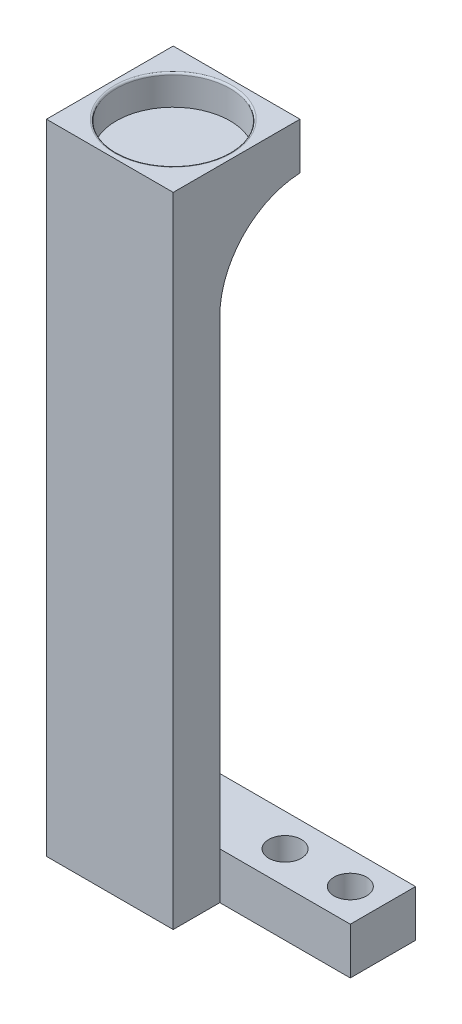
ISO-10303-21;
HEADER;
FILE_DESCRIPTION(('STEP AP214'),'2;1');
FILE_NAME('part.step','',(''),(''),'','','');
FILE_SCHEMA(('AUTOMOTIVE_DESIGN { 1 0 10303 214 1 1 1 1 }'));
ENDSEC;
DATA;
#1=APPLICATION_CONTEXT('core data for automotive mechanical design processes');
#2=APPLICATION_PROTOCOL_DEFINITION('international standard','automotive_design',2000,#1);
#3=PRODUCT_CONTEXT('',#1,'mechanical');
#4=PRODUCT('Part','Part','',(#3));
#5=PRODUCT_RELATED_PRODUCT_CATEGORY('part','',(#4));
#6=PRODUCT_DEFINITION_FORMATION('','',#4);
#7=PRODUCT_DEFINITION_CONTEXT('part definition',#1,'design');
#8=PRODUCT_DEFINITION('design','',#6,#7);
#9=PRODUCT_DEFINITION_SHAPE('','',#8);
#10=(LENGTH_UNIT() NAMED_UNIT(*) SI_UNIT(.MILLI.,.METRE.));
#11=(NAMED_UNIT(*) PLANE_ANGLE_UNIT() SI_UNIT($,.RADIAN.));
#12=(NAMED_UNIT(*) SI_UNIT($,.STERADIAN.) SOLID_ANGLE_UNIT());
#13=UNCERTAINTY_MEASURE_WITH_UNIT(LENGTH_MEASURE(1.E-05),#10,'distance_accuracy_value','');
#14=(GEOMETRIC_REPRESENTATION_CONTEXT(3) GLOBAL_UNCERTAINTY_ASSIGNED_CONTEXT((#13)) GLOBAL_UNIT_ASSIGNED_CONTEXT((#10,
#11,#12)) REPRESENTATION_CONTEXT('',''));
#15=CARTESIAN_POINT('',(0.,0.,0.));
#16=DIRECTION('',(0.,0.,1.));
#17=DIRECTION('',(1.,0.,0.));
#18=AXIS2_PLACEMENT_3D('',#15,#16,#17);
#19=CARTESIAN_POINT('',(20.4,-63.5,1.79999999999999));
#20=DIRECTION('',(0.,0.,1.));
#21=DIRECTION('',(-1.,0.,0.));
#22=AXIS2_PLACEMENT_3D('',#19,#20,#21);
#23=PLANE('',#22);
#24=DIRECTION('',(-1.,0.,0.));
#25=VECTOR('',#24,1.);
#26=CARTESIAN_POINT('',(6.8,-58.5,1.8));
#27=LINE('',#26,#25);
#28=CARTESIAN_POINT('',(20.4,-58.5,1.79999999999999));
#29=VERTEX_POINT('',#28);
#30=CARTESIAN_POINT('',(6.8,-58.5,1.8));
#31=VERTEX_POINT('',#30);
#32=EDGE_CURVE('E137',#29,#31,#27,.T.);
#33=ORIENTED_EDGE('',*,*,#32,.T.);
#34=DIRECTION('',(0.,1.,0.));
#35=VECTOR('',#34,1.);
#36=CARTESIAN_POINT('',(6.8,-63.5,1.8));
#37=LINE('',#36,#35);
#38=CARTESIAN_POINT('',(6.8,-8.99110671719561,1.8));
#39=VERTEX_POINT('',#38);
#40=EDGE_CURVE('E161',#31,#39,#37,.T.);
#41=ORIENTED_EDGE('',*,*,#40,.T.);
#42=DIRECTION('',(-1.,0.,0.));
#43=VECTOR('',#42,1.);
#44=CARTESIAN_POINT('',(20.4,-8.99110671719561,1.79999999999999));
#45=LINE('',#44,#43);
#46=CARTESIAN_POINT('',(20.4,-8.99110671719561,1.79999999999999));
#47=VERTEX_POINT('',#46);
#48=EDGE_CURVE('E200',#47,#39,#45,.T.);
#49=ORIENTED_EDGE('',*,*,#48,.F.);
#50=DIRECTION('',(0.,1.,0.));
#51=VECTOR('',#50,1.);
#52=CARTESIAN_POINT('',(20.4,-63.5,1.79999999999999));
#53=LINE('',#52,#51);
#54=EDGE_CURVE('E164',#29,#47,#53,.T.);
#55=ORIENTED_EDGE('',*,*,#54,.F.);
#56=EDGE_LOOP('',(#33,#41,#49,#55));
#57=FACE_BOUND('',#56,.T.);
#58=ADVANCED_FACE('F39',(#57),#23,.F.);
#59=CARTESIAN_POINT('',(6.8,5.,-6.8));
#60=DIRECTION('',(1.,0.,0.));
#61=DIRECTION('',(0.,0.,1.));
#62=AXIS2_PLACEMENT_3D('',#59,#60,#61);
#63=PLANE('',#62);
#64=DIRECTION('',(0.,-1.,0.));
#65=VECTOR('',#64,1.);
#66=CARTESIAN_POINT('',(6.8,5.,6.8));
#67=LINE('',#66,#65);
#68=CARTESIAN_POINT('',(6.8,5.,6.8));
#69=VERTEX_POINT('',#68);
#70=CARTESIAN_POINT('',(6.8,-63.5,6.8));
#71=VERTEX_POINT('',#70);
#72=EDGE_CURVE('E183',#69,#71,#67,.T.);
#73=ORIENTED_EDGE('',*,*,#72,.F.);
#74=DIRECTION('',(0.,0.,-1.));
#75=VECTOR('',#74,1.);
#76=CARTESIAN_POINT('',(6.8,5.,-6.8));
#77=LINE('',#76,#75);
#78=CARTESIAN_POINT('',(6.8,5.,-6.8));
#79=VERTEX_POINT('',#78);
#80=EDGE_CURVE('E172',#69,#79,#77,.T.);
#81=ORIENTED_EDGE('',*,*,#80,.T.);
#82=DIRECTION('',(0.,-1.,0.));
#83=VECTOR('',#82,1.);
#84=CARTESIAN_POINT('',(6.8,5.,-6.8));
#85=LINE('',#84,#83);
#86=CARTESIAN_POINT('',(6.8,0.,-6.8));
#87=VERTEX_POINT('',#86);
#88=EDGE_CURVE('E192',#79,#87,#85,.T.);
#89=ORIENTED_EDGE('',*,*,#88,.T.);
#90=CARTESIAN_POINT('',(6.8,-8.99110671719561,-7.2));
#91=DIRECTION('',(-1.,0.,0.));
#92=DIRECTION('',(0.,0.,1.));
#93=AXIS2_PLACEMENT_3D('',#90,#91,#92);
#94=CIRCLE('',#93,9.);
#95=EDGE_CURVE('E47',#39,#87,#94,.T.);
#96=ORIENTED_EDGE('',*,*,#95,.F.);
#97=ORIENTED_EDGE('',*,*,#40,.F.);
#98=DIRECTION('',(0.,0.,1.));
#99=VECTOR('',#98,1.);
#100=CARTESIAN_POINT('',(6.8,-58.5,-5.2));
#101=LINE('',#100,#99);
#102=CARTESIAN_POINT('',(6.8,-58.5,-5.2));
#103=VERTEX_POINT('',#102);
#104=EDGE_CURVE('E134',#103,#31,#101,.T.);
#105=ORIENTED_EDGE('',*,*,#104,.F.);
#106=DIRECTION('',(0.,-1.,0.));
#107=VECTOR('',#106,1.);
#108=CARTESIAN_POINT('',(6.8,-63.5,-5.2));
#109=LINE('',#108,#107);
#110=CARTESIAN_POINT('',(6.8,-63.5,-5.2));
#111=VERTEX_POINT('',#110);
#112=EDGE_CURVE('E116',#103,#111,#109,.T.);
#113=ORIENTED_EDGE('',*,*,#112,.T.);
#114=DIRECTION('',(0.,0.,1.));
#115=VECTOR('',#114,1.);
#116=CARTESIAN_POINT('',(6.8,-63.5,6.8));
#117=LINE('',#116,#115);
#118=EDGE_CURVE('E125',#111,#71,#117,.T.);
#119=ORIENTED_EDGE('',*,*,#118,.T.);
#120=EDGE_LOOP('',(#73,#81,#89,#96,#97,#105,#113,#119));
#121=FACE_BOUND('',#120,.T.);
#122=ADVANCED_FACE('F133',(#121),#63,.F.);
#123=CARTESIAN_POINT('',(20.4,5.,-6.8));
#124=DIRECTION('',(0.,0.,1.));
#125=DIRECTION('',(-1.,0.,0.));
#126=AXIS2_PLACEMENT_3D('',#123,#124,#125);
#127=PLANE('',#126);
#128=DIRECTION('',(1.,0.,0.));
#129=VECTOR('',#128,1.);
#130=CARTESIAN_POINT('',(20.4,0.,-6.8));
#131=LINE('',#130,#129);
#132=CARTESIAN_POINT('',(20.4,0.,-6.8));
#133=VERTEX_POINT('',#132);
#134=EDGE_CURVE('E171',#87,#133,#131,.T.);
#135=ORIENTED_EDGE('',*,*,#134,.F.);
#136=ORIENTED_EDGE('',*,*,#88,.F.);
#137=DIRECTION('',(1.,0.,0.));
#138=VECTOR('',#137,1.);
#139=CARTESIAN_POINT('',(20.4,5.,-6.8));
#140=LINE('',#139,#138);
#141=CARTESIAN_POINT('',(20.4,5.,-6.8));
#142=VERTEX_POINT('',#141);
#143=EDGE_CURVE('E175',#79,#142,#140,.T.);
#144=ORIENTED_EDGE('',*,*,#143,.T.);
#145=DIRECTION('',(0.,-1.,0.));
#146=VECTOR('',#145,1.);
#147=CARTESIAN_POINT('',(20.4,5.,-6.8));
#148=LINE('',#147,#146);
#149=EDGE_CURVE('E189',#142,#133,#148,.T.);
#150=ORIENTED_EDGE('',*,*,#149,.T.);
#151=EDGE_LOOP('',(#135,#136,#144,#150));
#152=FACE_BOUND('',#151,.T.);
#153=ADVANCED_FACE('F205',(#152),#127,.F.);
#154=CARTESIAN_POINT('',(20.4,5.,-6.8));
#155=DIRECTION('',(-1.,0.,0.));
#156=DIRECTION('',(0.,0.,-1.));
#157=AXIS2_PLACEMENT_3D('',#154,#155,#156);
#158=PLANE('',#157);
#159=ORIENTED_EDGE('',*,*,#149,.F.);
#160=DIRECTION('',(0.,0.,1.));
#161=VECTOR('',#160,1.);
#162=CARTESIAN_POINT('',(20.4,5.,-6.8));
#163=LINE('',#162,#161);
#164=CARTESIAN_POINT('',(20.4,5.,6.79999999999999));
#165=VERTEX_POINT('',#164);
#166=EDGE_CURVE('E178',#142,#165,#163,.T.);
#167=ORIENTED_EDGE('',*,*,#166,.T.);
#168=DIRECTION('',(0.,-1.,0.));
#169=VECTOR('',#168,1.);
#170=CARTESIAN_POINT('',(20.4,5.,6.79999999999999));
#171=LINE('',#170,#169);
#172=CARTESIAN_POINT('',(20.4,-63.5,6.79999999999999));
#173=VERTEX_POINT('',#172);
#174=EDGE_CURVE('E186',#165,#173,#171,.T.);
#175=ORIENTED_EDGE('',*,*,#174,.T.);
#176=DIRECTION('',(0.,0.,-1.));
#177=VECTOR('',#176,1.);
#178=CARTESIAN_POINT('',(20.4,-63.5,6.79999999999999));
#179=LINE('',#178,#177);
#180=CARTESIAN_POINT('',(20.4,-63.5,1.79999999999999));
#181=VERTEX_POINT('',#180);
#182=EDGE_CURVE('E131',#173,#181,#179,.T.);
#183=ORIENTED_EDGE('',*,*,#182,.T.);
#184=EDGE_CURVE('E165',#181,#29,#53,.T.);
#185=ORIENTED_EDGE('',*,*,#184,.T.);
#186=ORIENTED_EDGE('',*,*,#54,.T.);
#187=CARTESIAN_POINT('',(20.4,-8.99110671719561,-7.20000000000001));
#188=DIRECTION('',(1.,0.,0.));
#189=DIRECTION('',(0.,0.,-1.));
#190=AXIS2_PLACEMENT_3D('',#187,#188,#189);
#191=CIRCLE('',#190,9.);
#192=EDGE_CURVE('E11',#133,#47,#191,.T.);
#193=ORIENTED_EDGE('',*,*,#192,.F.);
#194=EDGE_LOOP('',(#159,#167,#175,#183,#185,#186,#193));
#195=FACE_BOUND('',#194,.T.);
#196=ADVANCED_FACE('F208',(#195),#158,.F.);
#197=CARTESIAN_POINT('',(20.4,5.,6.79999999999999));
#198=DIRECTION('',(0.,0.,-1.));
#199=DIRECTION('',(1.,0.,0.));
#200=AXIS2_PLACEMENT_3D('',#197,#198,#199);
#201=PLANE('',#200);
#202=ORIENTED_EDGE('',*,*,#174,.F.);
#203=DIRECTION('',(-1.,0.,0.));
#204=VECTOR('',#203,1.);
#205=CARTESIAN_POINT('',(20.4,5.,6.79999999999999));
#206=LINE('',#205,#204);
#207=EDGE_CURVE('E181',#165,#69,#206,.T.);
#208=ORIENTED_EDGE('',*,*,#207,.T.);
#209=ORIENTED_EDGE('',*,*,#72,.T.);
#210=DIRECTION('',(1.,0.,0.));
#211=VECTOR('',#210,1.);
#212=CARTESIAN_POINT('',(20.4,-63.5,6.79999999999999));
#213=LINE('',#212,#211);
#214=EDGE_CURVE('E128',#71,#173,#213,.T.);
#215=ORIENTED_EDGE('',*,*,#214,.T.);
#216=EDGE_LOOP('',(#202,#208,#209,#215));
#217=FACE_BOUND('',#216,.T.);
#218=ADVANCED_FACE('F224',(#217),#201,.F.);
#219=CARTESIAN_POINT('',(13.6,5.,0.));
#220=DIRECTION('',(0.,1.,0.));
#221=DIRECTION('',(0.,0.,1.));
#222=AXIS2_PLACEMENT_3D('',#219,#220,#221);
#223=PLANE('',#222);
#224=CARTESIAN_POINT('',(13.6,5.,0.));
#225=DIRECTION('',(0.,-1.,0.));
#226=DIRECTION('',(0.,0.,1.));
#227=AXIS2_PLACEMENT_3D('',#224,#225,#226);
#228=CIRCLE('',#227,6.3);
#229=CARTESIAN_POINT('',(13.6,5.,6.3));
#230=VERTEX_POINT('',#229);
#231=EDGE_CURVE('E197',#230,#230,#228,.F.);
#232=ORIENTED_EDGE('',*,*,#231,.F.);
#233=EDGE_LOOP('',(#232));
#234=FACE_BOUND('',#233,.T.);
#235=ORIENTED_EDGE('',*,*,#80,.F.);
#236=ORIENTED_EDGE('',*,*,#207,.F.);
#237=ORIENTED_EDGE('',*,*,#166,.F.);
#238=ORIENTED_EDGE('',*,*,#143,.F.);
#239=EDGE_LOOP('',(#235,#236,#237,#238));
#240=FACE_BOUND('',#239,.T.);
#241=ADVANCED_FACE('F226',(#234,#240),#223,.T.);
#242=CARTESIAN_POINT('',(13.6,1.8,0.));
#243=DIRECTION('',(0.,1.,0.));
#244=DIRECTION('',(0.,0.,1.));
#245=AXIS2_PLACEMENT_3D('',#242,#243,#244);
#246=CYLINDRICAL_SURFACE('',#245,6.1);
#247=CARTESIAN_POINT('',(13.6,4.8,0.));
#248=DIRECTION('',(0.,-1.,0.));
#249=DIRECTION('',(0.,0.,1.));
#250=AXIS2_PLACEMENT_3D('',#247,#248,#249);
#251=CIRCLE('',#250,6.1);
#252=CARTESIAN_POINT('',(13.6,4.8,6.1));
#253=VERTEX_POINT('',#252);
#254=EDGE_CURVE('E194',#253,#253,#251,.T.);
#255=ORIENTED_EDGE('',*,*,#254,.F.);
#256=EDGE_LOOP('',(#255));
#257=FACE_BOUND('',#256,.T.);
#258=CARTESIAN_POINT('',(13.6,1.8,0.));
#259=DIRECTION('',(0.,-1.,0.));
#260=DIRECTION('',(0.,0.,1.));
#261=AXIS2_PLACEMENT_3D('',#258,#259,#260);
#262=CIRCLE('',#261,6.1);
#263=CARTESIAN_POINT('',(13.6,1.8,6.1));
#264=VERTEX_POINT('',#263);
#265=EDGE_CURVE('E168',#264,#264,#262,.T.);
#266=ORIENTED_EDGE('',*,*,#265,.T.);
#267=EDGE_LOOP('',(#266));
#268=FACE_BOUND('',#267,.T.);
#269=ADVANCED_FACE('F228',(#257,#268),#246,.F.);
#270=CARTESIAN_POINT('',(13.6,1.8,0.));
#271=DIRECTION('',(0.,1.,0.));
#272=DIRECTION('',(0.,0.,1.));
#273=AXIS2_PLACEMENT_3D('',#270,#271,#272);
#274=PLANE('',#273);
#275=ORIENTED_EDGE('',*,*,#265,.F.);
#276=EDGE_LOOP('',(#275));
#277=FACE_BOUND('',#276,.T.);
#278=ADVANCED_FACE('F235',(#277),#274,.T.);
#279=CARTESIAN_POINT('',(13.6,-63.5,0.));
#280=DIRECTION('',(0.,-1.,0.));
#281=DIRECTION('',(0.,0.,-1.));
#282=AXIS2_PLACEMENT_3D('',#279,#280,#281);
#283=PLANE('',#282);
#284=CARTESIAN_POINT('',(23.9,-63.5,-1.70000000000001));
#285=DIRECTION('',(0.,-1.,0.));
#286=DIRECTION('',(0.,0.,1.));
#287=AXIS2_PLACEMENT_3D('',#284,#285,#286);
#288=CIRCLE('',#287,1.75);
#289=CARTESIAN_POINT('',(23.9,-63.5,0.0499999999999912));
#290=VERTEX_POINT('',#289);
#291=EDGE_CURVE('E150',#290,#290,#288,.T.);
#292=ORIENTED_EDGE('',*,*,#291,.F.);
#293=EDGE_LOOP('',(#292));
#294=FACE_BOUND('',#293,.T.);
#295=CARTESIAN_POINT('',(30.9,-63.5,-1.70000000000001));
#296=DIRECTION('',(0.,-1.,0.));
#297=DIRECTION('',(0.,0.,1.));
#298=AXIS2_PLACEMENT_3D('',#295,#296,#297);
#299=CIRCLE('',#298,1.75);
#300=CARTESIAN_POINT('',(30.9,-63.5,0.0499999999999904));
#301=VERTEX_POINT('',#300);
#302=EDGE_CURVE('E140',#301,#301,#299,.T.);
#303=ORIENTED_EDGE('',*,*,#302,.F.);
#304=EDGE_LOOP('',(#303));
#305=FACE_BOUND('',#304,.T.);
#306=ORIENTED_EDGE('',*,*,#182,.F.);
#307=ORIENTED_EDGE('',*,*,#214,.F.);
#308=ORIENTED_EDGE('',*,*,#118,.F.);
#309=DIRECTION('',(1.,0.,0.));
#310=VECTOR('',#309,1.);
#311=CARTESIAN_POINT('',(6.8,-63.5,-5.2));
#312=LINE('',#311,#310);
#313=CARTESIAN_POINT('',(34.4,-63.5,-5.20000000000001));
#314=VERTEX_POINT('',#313);
#315=EDGE_CURVE('E112',#111,#314,#312,.T.);
#316=ORIENTED_EDGE('',*,*,#315,.T.);
#317=DIRECTION('',(0.,0.,1.));
#318=VECTOR('',#317,1.);
#319=CARTESIAN_POINT('',(34.4,-63.5,-5.20000000000001));
#320=LINE('',#319,#318);
#321=CARTESIAN_POINT('',(34.4,-63.5,1.79999999999999));
#322=VERTEX_POINT('',#321);
#323=EDGE_CURVE('E156',#314,#322,#320,.T.);
#324=ORIENTED_EDGE('',*,*,#323,.T.);
#325=DIRECTION('',(1.,0.,0.));
#326=VECTOR('',#325,1.);
#327=CARTESIAN_POINT('',(6.8,-63.5,1.8));
#328=LINE('',#327,#326);
#329=EDGE_CURVE('E146',#181,#322,#328,.T.);
#330=ORIENTED_EDGE('',*,*,#329,.F.);
#331=EDGE_LOOP('',(#306,#307,#308,#316,#324,#330));
#332=FACE_BOUND('',#331,.T.);
#333=ADVANCED_FACE('F127',(#294,#305,#332),#283,.T.);
#334=CARTESIAN_POINT('',(13.6,4.8,0.));
#335=DIRECTION('',(0.,1.,0.));
#336=DIRECTION('',(0.,0.,1.));
#337=AXIS2_PLACEMENT_3D('',#334,#335,#336);
#338=TOROIDAL_SURFACE('',#337,6.3,0.2);
#339=ORIENTED_EDGE('',*,*,#231,.T.);
#340=EDGE_LOOP('',(#339));
#341=FACE_BOUND('',#340,.T.);
#342=ORIENTED_EDGE('',*,*,#254,.T.);
#343=EDGE_LOOP('',(#342));
#344=FACE_BOUND('',#343,.T.);
#345=ADVANCED_FACE('F254',(#341,#344),#338,.T.);
#346=CARTESIAN_POINT('',(13.6,-8.99110671719561,-7.2));
#347=DIRECTION('',(-1.,0.,0.));
#348=DIRECTION('',(0.,0.,-1.));
#349=AXIS2_PLACEMENT_3D('',#346,#347,#348);
#350=CYLINDRICAL_SURFACE('',#349,9.);
#351=ORIENTED_EDGE('',*,*,#192,.T.);
#352=ORIENTED_EDGE('',*,*,#48,.T.);
#353=ORIENTED_EDGE('',*,*,#95,.T.);
#354=ORIENTED_EDGE('',*,*,#134,.T.);
#355=EDGE_LOOP('',(#351,#352,#353,#354));
#356=FACE_BOUND('',#355,.T.);
#357=ADVANCED_FACE('F41',(#356),#350,.F.);
#358=CARTESIAN_POINT('',(13.6,0.,1.8));
#359=DIRECTION('',(0.,0.,1.));
#360=DIRECTION('',(-1.,0.,0.));
#361=AXIS2_PLACEMENT_3D('',#358,#359,#360);
#362=PLANE('',#361);
#363=ORIENTED_EDGE('',*,*,#184,.F.);
#364=ORIENTED_EDGE('',*,*,#329,.T.);
#365=DIRECTION('',(0.,1.,0.));
#366=VECTOR('',#365,1.);
#367=CARTESIAN_POINT('',(34.4,-63.5,1.79999999999999));
#368=LINE('',#367,#366);
#369=CARTESIAN_POINT('',(34.4,-58.5,1.79999999999999));
#370=VERTEX_POINT('',#369);
#371=EDGE_CURVE('E149',#322,#370,#368,.T.);
#372=ORIENTED_EDGE('',*,*,#371,.T.);
#373=EDGE_CURVE('E135',#370,#29,#27,.T.);
#374=ORIENTED_EDGE('',*,*,#373,.T.);
#375=EDGE_LOOP('',(#363,#364,#372,#374));
#376=FACE_BOUND('',#375,.T.);
#377=ADVANCED_FACE('F221',(#376),#362,.T.);
#378=CARTESIAN_POINT('',(34.4,-63.5,-5.20000000000001));
#379=DIRECTION('',(-1.,0.,0.));
#380=DIRECTION('',(0.,0.,-1.));
#381=AXIS2_PLACEMENT_3D('',#378,#379,#380);
#382=PLANE('',#381);
#383=ORIENTED_EDGE('',*,*,#371,.F.);
#384=ORIENTED_EDGE('',*,*,#323,.F.);
#385=DIRECTION('',(0.,1.,0.));
#386=VECTOR('',#385,1.);
#387=CARTESIAN_POINT('',(34.4,-63.5,-5.20000000000001));
#388=LINE('',#387,#386);
#389=CARTESIAN_POINT('',(34.4,-58.5,-5.20000000000001));
#390=VERTEX_POINT('',#389);
#391=EDGE_CURVE('E119',#314,#390,#388,.T.);
#392=ORIENTED_EDGE('',*,*,#391,.T.);
#393=DIRECTION('',(0.,0.,1.));
#394=VECTOR('',#393,1.);
#395=CARTESIAN_POINT('',(34.4,-58.5,-5.20000000000001));
#396=LINE('',#395,#394);
#397=EDGE_CURVE('E154',#390,#370,#396,.T.);
#398=ORIENTED_EDGE('',*,*,#397,.T.);
#399=EDGE_LOOP('',(#383,#384,#392,#398));
#400=FACE_BOUND('',#399,.T.);
#401=ADVANCED_FACE('F219',(#400),#382,.F.);
#402=CARTESIAN_POINT('',(6.8,-58.5,-5.2));
#403=DIRECTION('',(0.,-1.,0.));
#404=DIRECTION('',(0.,0.,-1.));
#405=AXIS2_PLACEMENT_3D('',#402,#403,#404);
#406=PLANE('',#405);
#407=CARTESIAN_POINT('',(23.9,-58.5,-1.70000000000001));
#408=DIRECTION('',(0.,-1.,0.));
#409=DIRECTION('',(0.,0.,1.));
#410=AXIS2_PLACEMENT_3D('',#407,#408,#409);
#411=CIRCLE('',#410,1.75);
#412=CARTESIAN_POINT('',(23.9,-58.5,0.0499999999999912));
#413=VERTEX_POINT('',#412);
#414=EDGE_CURVE('E270',#413,#413,#411,.T.);
#415=ORIENTED_EDGE('',*,*,#414,.T.);
#416=EDGE_LOOP('',(#415));
#417=FACE_BOUND('',#416,.T.);
#418=CARTESIAN_POINT('',(30.9,-58.5,-1.70000000000001));
#419=DIRECTION('',(0.,-1.,0.));
#420=DIRECTION('',(0.,0.,1.));
#421=AXIS2_PLACEMENT_3D('',#418,#419,#420);
#422=CIRCLE('',#421,1.75);
#423=CARTESIAN_POINT('',(30.9,-58.5,0.0499999999999904));
#424=VERTEX_POINT('',#423);
#425=EDGE_CURVE('E268',#424,#424,#422,.T.);
#426=ORIENTED_EDGE('',*,*,#425,.T.);
#427=EDGE_LOOP('',(#426));
#428=FACE_BOUND('',#427,.T.);
#429=ORIENTED_EDGE('',*,*,#373,.F.);
#430=ORIENTED_EDGE('',*,*,#397,.F.);
#431=DIRECTION('',(-1.,0.,0.));
#432=VECTOR('',#431,1.);
#433=CARTESIAN_POINT('',(6.8,-58.5,-5.2));
#434=LINE('',#433,#432);
#435=EDGE_CURVE('E144',#390,#103,#434,.T.);
#436=ORIENTED_EDGE('',*,*,#435,.T.);
#437=ORIENTED_EDGE('',*,*,#104,.T.);
#438=ORIENTED_EDGE('',*,*,#32,.F.);
#439=EDGE_LOOP('',(#429,#430,#436,#437,#438));
#440=FACE_BOUND('',#439,.T.);
#441=ADVANCED_FACE('F216',(#417,#428,#440),#406,.F.);
#442=CARTESIAN_POINT('',(13.6,0.,-5.2));
#443=DIRECTION('',(0.,0.,1.));
#444=DIRECTION('',(-1.,0.,0.));
#445=AXIS2_PLACEMENT_3D('',#442,#443,#444);
#446=PLANE('',#445);
#447=ORIENTED_EDGE('',*,*,#112,.F.);
#448=ORIENTED_EDGE('',*,*,#435,.F.);
#449=ORIENTED_EDGE('',*,*,#391,.F.);
#450=ORIENTED_EDGE('',*,*,#315,.F.);
#451=EDGE_LOOP('',(#447,#448,#449,#450));
#452=FACE_BOUND('',#451,.T.);
#453=ADVANCED_FACE('F114',(#452),#446,.F.);
#454=CARTESIAN_POINT('',(30.9,-63.5,-1.70000000000001));
#455=DIRECTION('',(0.,1.,0.));
#456=DIRECTION('',(0.,0.,1.));
#457=AXIS2_PLACEMENT_3D('',#454,#455,#456);
#458=CYLINDRICAL_SURFACE('',#457,1.75);
#459=ORIENTED_EDGE('',*,*,#302,.T.);
#460=EDGE_LOOP('',(#459));
#461=FACE_BOUND('',#460,.T.);
#462=ORIENTED_EDGE('',*,*,#425,.F.);
#463=EDGE_LOOP('',(#462));
#464=FACE_BOUND('',#463,.T.);
#465=ADVANCED_FACE('F280',(#461,#464),#458,.F.);
#466=CARTESIAN_POINT('',(23.9,-63.5,-1.70000000000001));
#467=DIRECTION('',(0.,1.,0.));
#468=DIRECTION('',(0.,0.,1.));
#469=AXIS2_PLACEMENT_3D('',#466,#467,#468);
#470=CYLINDRICAL_SURFACE('',#469,1.75);
#471=ORIENTED_EDGE('',*,*,#291,.T.);
#472=EDGE_LOOP('',(#471));
#473=FACE_BOUND('',#472,.T.);
#474=ORIENTED_EDGE('',*,*,#414,.F.);
#475=EDGE_LOOP('',(#474));
#476=FACE_BOUND('',#475,.T.);
#477=ADVANCED_FACE('F277',(#473,#476),#470,.F.);
#478=CLOSED_SHELL('',(#58,#122,#153,#196,#218,#241,#269,#278,#333,#345,#357,#377,#401,#441,#453,
#465,#477));
#479=MANIFOLD_SOLID_BREP('B2',#478);
#480=ADVANCED_BREP_SHAPE_REPRESENTATION('',(#18,#479),#14);
#481=SHAPE_DEFINITION_REPRESENTATION(#9,#480);
ENDSEC;
END-ISO-10303-21;
